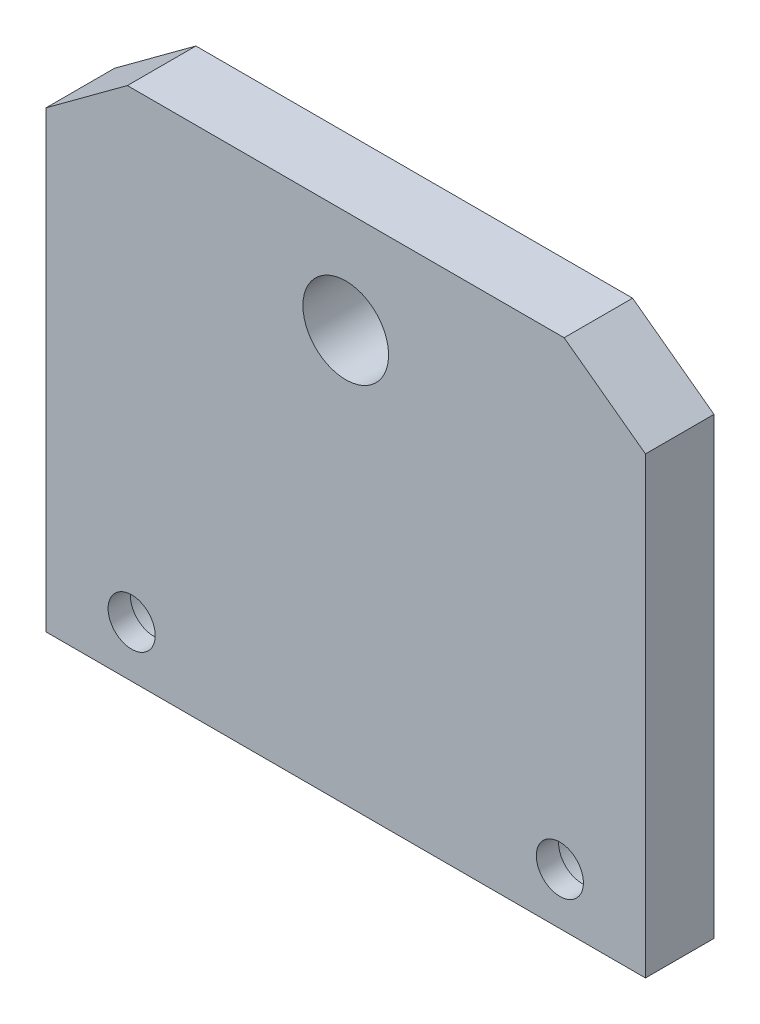
ISO-10303-21;
HEADER;
FILE_DESCRIPTION(('STEP AP214'),'2;1');
FILE_NAME('part.step','',(''),(''),'','','');
FILE_SCHEMA(('AUTOMOTIVE_DESIGN { 1 0 10303 214 1 1 1 1 }'));
ENDSEC;
DATA;
#1=APPLICATION_CONTEXT('core data for automotive mechanical design processes');
#2=APPLICATION_PROTOCOL_DEFINITION('international standard','automotive_design',2000,#1);
#3=PRODUCT_CONTEXT('',#1,'mechanical');
#4=PRODUCT('Part','Part','',(#3));
#5=PRODUCT_RELATED_PRODUCT_CATEGORY('part','',(#4));
#6=PRODUCT_DEFINITION_FORMATION('','',#4);
#7=PRODUCT_DEFINITION_CONTEXT('part definition',#1,'design');
#8=PRODUCT_DEFINITION('design','',#6,#7);
#9=PRODUCT_DEFINITION_SHAPE('','',#8);
#10=(LENGTH_UNIT() NAMED_UNIT(*) SI_UNIT(.MILLI.,.METRE.));
#11=(NAMED_UNIT(*) PLANE_ANGLE_UNIT() SI_UNIT($,.RADIAN.));
#12=(NAMED_UNIT(*) SI_UNIT($,.STERADIAN.) SOLID_ANGLE_UNIT());
#13=UNCERTAINTY_MEASURE_WITH_UNIT(LENGTH_MEASURE(1.E-05),#10,'distance_accuracy_value','');
#14=(GEOMETRIC_REPRESENTATION_CONTEXT(3) GLOBAL_UNCERTAINTY_ASSIGNED_CONTEXT((#13)) GLOBAL_UNIT_ASSIGNED_CONTEXT((#10,
#11,#12)) REPRESENTATION_CONTEXT('',''));
#15=CARTESIAN_POINT('',(0.,0.,0.));
#16=DIRECTION('',(0.,0.,1.));
#17=DIRECTION('',(1.,0.,0.));
#18=AXIS2_PLACEMENT_3D('',#15,#16,#17);
#19=CARTESIAN_POINT('',(-57.7328551190203,45.1684320360903,8.));
#20=DIRECTION('',(0.,1.,0.));
#21=DIRECTION('',(0.,0.,1.));
#22=AXIS2_PLACEMENT_3D('',#19,#20,#21);
#23=PLANE('',#22);
#24=DIRECTION('',(0.,0.,1.));
#25=VECTOR('',#24,1.);
#26=CARTESIAN_POINT('',(-48.2328551190203,45.1684320360903,-34.));
#27=LINE('',#26,#25);
#28=CARTESIAN_POINT('',(-48.2328551190203,45.1684320360903,0.));
#29=VERTEX_POINT('',#28);
#30=CARTESIAN_POINT('',(-48.2328551190203,45.1684320360903,8.));
#31=VERTEX_POINT('',#30);
#32=EDGE_CURVE('E66',#29,#31,#27,.T.);
#33=ORIENTED_EDGE('',*,*,#32,.T.);
#34=DIRECTION('',(1.,0.,0.));
#35=VECTOR('',#34,1.);
#36=CARTESIAN_POINT('',(-57.7328551190203,45.1684320360903,8.));
#37=LINE('',#36,#35);
#38=CARTESIAN_POINT('',(2.76714488097968,45.1684320360903,8.));
#39=VERTEX_POINT('',#38);
#40=EDGE_CURVE('E110',#31,#39,#37,.T.);
#41=ORIENTED_EDGE('',*,*,#40,.T.);
#42=DIRECTION('',(0.,0.,1.));
#43=VECTOR('',#42,1.);
#44=CARTESIAN_POINT('',(2.76714488097968,45.1684320360903,-34.));
#45=LINE('',#44,#43);
#46=CARTESIAN_POINT('',(2.76714488097968,45.1684320360903,0.));
#47=VERTEX_POINT('',#46);
#48=EDGE_CURVE('E147',#47,#39,#45,.T.);
#49=ORIENTED_EDGE('',*,*,#48,.F.);
#50=DIRECTION('',(1.,0.,0.));
#51=VECTOR('',#50,1.);
#52=CARTESIAN_POINT('',(-57.7328551190203,45.1684320360903,0.));
#53=LINE('',#52,#51);
#54=EDGE_CURVE('E126',#29,#47,#53,.T.);
#55=ORIENTED_EDGE('',*,*,#54,.F.);
#56=EDGE_LOOP('',(#33,#41,#49,#55));
#57=FACE_BOUND('',#56,.T.);
#58=ADVANCED_FACE('F43',(#57),#23,.T.);
#59=CARTESIAN_POINT('',(-57.7328551190203,45.1684320360903,8.));
#60=DIRECTION('',(1.,0.,0.));
#61=DIRECTION('',(0.,0.,-1.));
#62=AXIS2_PLACEMENT_3D('',#59,#60,#61);
#63=PLANE('',#62);
#64=DIRECTION('',(0.,-1.,0.));
#65=VECTOR('',#64,1.);
#66=CARTESIAN_POINT('',(-57.7328551190203,45.1684320360903,8.));
#67=LINE('',#66,#65);
#68=CARTESIAN_POINT('',(-57.7328551190203,38.1684320360903,8.));
#69=VERTEX_POINT('',#68);
#70=CARTESIAN_POINT('',(-57.7328551190203,-14.8315679639097,8.));
#71=VERTEX_POINT('',#70);
#72=EDGE_CURVE('E106',#69,#71,#67,.T.);
#73=ORIENTED_EDGE('',*,*,#72,.F.);
#74=DIRECTION('',(0.,0.,1.));
#75=VECTOR('',#74,1.);
#76=CARTESIAN_POINT('',(-57.7328551190203,38.1684320360903,-34.));
#77=LINE('',#76,#75);
#78=CARTESIAN_POINT('',(-57.7328551190203,38.1684320360903,0.));
#79=VERTEX_POINT('',#78);
#80=EDGE_CURVE('E94',#79,#69,#77,.T.);
#81=ORIENTED_EDGE('',*,*,#80,.F.);
#82=DIRECTION('',(0.,-1.,0.));
#83=VECTOR('',#82,1.);
#84=CARTESIAN_POINT('',(-57.7328551190203,45.1684320360903,0.));
#85=LINE('',#84,#83);
#86=CARTESIAN_POINT('',(-57.7328551190203,-14.8315679639097,0.));
#87=VERTEX_POINT('',#86);
#88=EDGE_CURVE('E135',#79,#87,#85,.T.);
#89=ORIENTED_EDGE('',*,*,#88,.T.);
#90=DIRECTION('',(0.,0.,-1.));
#91=VECTOR('',#90,1.);
#92=CARTESIAN_POINT('',(-57.7328551190203,-14.8315679639097,8.));
#93=LINE('',#92,#91);
#94=EDGE_CURVE('E115',#71,#87,#93,.T.);
#95=ORIENTED_EDGE('',*,*,#94,.F.);
#96=EDGE_LOOP('',(#73,#81,#89,#95));
#97=FACE_BOUND('',#96,.T.);
#98=ADVANCED_FACE('F113',(#97),#63,.F.);
#99=CARTESIAN_POINT('',(-57.7328551190203,-14.8315679639097,8.));
#100=DIRECTION('',(0.,1.,0.));
#101=DIRECTION('',(0.,0.,1.));
#102=AXIS2_PLACEMENT_3D('',#99,#100,#101);
#103=PLANE('',#102);
#104=DIRECTION('',(1.,0.,0.));
#105=VECTOR('',#104,1.);
#106=CARTESIAN_POINT('',(-57.7328551190203,-14.8315679639097,0.));
#107=LINE('',#106,#105);
#108=CARTESIAN_POINT('',(12.2671448809797,-14.8315679639097,0.));
#109=VERTEX_POINT('',#108);
#110=EDGE_CURVE('E132',#87,#109,#107,.T.);
#111=ORIENTED_EDGE('',*,*,#110,.T.);
#112=DIRECTION('',(0.,0.,-1.));
#113=VECTOR('',#112,1.);
#114=CARTESIAN_POINT('',(12.2671448809797,-14.8315679639097,8.));
#115=LINE('',#114,#113);
#116=CARTESIAN_POINT('',(12.2671448809797,-14.8315679639097,8.));
#117=VERTEX_POINT('',#116);
#118=EDGE_CURVE('E117',#117,#109,#115,.T.);
#119=ORIENTED_EDGE('',*,*,#118,.F.);
#120=DIRECTION('',(1.,0.,0.));
#121=VECTOR('',#120,1.);
#122=CARTESIAN_POINT('',(-57.7328551190203,-14.8315679639097,8.));
#123=LINE('',#122,#121);
#124=EDGE_CURVE('E118',#71,#117,#123,.T.);
#125=ORIENTED_EDGE('',*,*,#124,.F.);
#126=ORIENTED_EDGE('',*,*,#94,.T.);
#127=EDGE_LOOP('',(#111,#119,#125,#126));
#128=FACE_BOUND('',#127,.T.);
#129=ADVANCED_FACE('F176',(#128),#103,.F.);
#130=CARTESIAN_POINT('',(12.2671448809797,45.1684320360903,8.));
#131=DIRECTION('',(1.,0.,0.));
#132=DIRECTION('',(0.,1.,0.));
#133=AXIS2_PLACEMENT_3D('',#130,#131,#132);
#134=PLANE('',#133);
#135=DIRECTION('',(0.,0.,1.));
#136=VECTOR('',#135,1.);
#137=CARTESIAN_POINT('',(12.2671448809797,38.1684320360903,-34.));
#138=LINE('',#137,#136);
#139=CARTESIAN_POINT('',(12.2671448809797,38.1684320360903,0.));
#140=VERTEX_POINT('',#139);
#141=CARTESIAN_POINT('',(12.2671448809797,38.1684320360903,8.));
#142=VERTEX_POINT('',#141);
#143=EDGE_CURVE('E59',#140,#142,#138,.T.);
#144=ORIENTED_EDGE('',*,*,#143,.T.);
#145=DIRECTION('',(0.,-1.,0.));
#146=VECTOR('',#145,1.);
#147=CARTESIAN_POINT('',(12.2671448809797,45.1684320360903,8.));
#148=LINE('',#147,#146);
#149=EDGE_CURVE('E122',#142,#117,#148,.T.);
#150=ORIENTED_EDGE('',*,*,#149,.T.);
#151=ORIENTED_EDGE('',*,*,#118,.T.);
#152=DIRECTION('',(0.,-1.,0.));
#153=VECTOR('',#152,1.);
#154=CARTESIAN_POINT('',(12.2671448809797,45.1684320360903,0.));
#155=LINE('',#154,#153);
#156=EDGE_CURVE('E129',#140,#109,#155,.T.);
#157=ORIENTED_EDGE('',*,*,#156,.F.);
#158=EDGE_LOOP('',(#144,#150,#151,#157));
#159=FACE_BOUND('',#158,.T.);
#160=ADVANCED_FACE('F172',(#159),#134,.T.);
#161=CARTESIAN_POINT('',(0.,0.,8.));
#162=DIRECTION('',(0.,0.,-1.));
#163=DIRECTION('',(-1.,0.,0.));
#164=AXIS2_PLACEMENT_3D('',#161,#162,#163);
#165=PLANE('',#164);
#166=CARTESIAN_POINT('',(-22.7328551190203,33.1684320360903,7.99999999999999));
#167=DIRECTION('',(0.,0.,-1.));
#168=DIRECTION('',(-1.,0.,0.));
#169=AXIS2_PLACEMENT_3D('',#166,#167,#168);
#170=CIRCLE('',#169,5.);
#171=CARTESIAN_POINT('',(-27.7328551190203,33.1684320360903,7.99999999999999));
#172=VERTEX_POINT('',#171);
#173=EDGE_CURVE('E141',#172,#172,#170,.T.);
#174=ORIENTED_EDGE('',*,*,#173,.T.);
#175=EDGE_LOOP('',(#174));
#176=FACE_BOUND('',#175,.T.);
#177=CARTESIAN_POINT('',(2.26714488097969,-8.83156796390972,8.));
#178=DIRECTION('',(0.,0.,-1.));
#179=DIRECTION('',(-1.,0.,0.));
#180=AXIS2_PLACEMENT_3D('',#177,#178,#179);
#181=CIRCLE('',#180,2.75);
#182=CARTESIAN_POINT('',(-0.48285511902031,-8.83156796390972,8.));
#183=VERTEX_POINT('',#182);
#184=EDGE_CURVE('E165',#183,#183,#181,.T.);
#185=ORIENTED_EDGE('',*,*,#184,.T.);
#186=EDGE_LOOP('',(#185));
#187=FACE_BOUND('',#186,.T.);
#188=CARTESIAN_POINT('',(-47.7328551190203,-8.83156796390972,8.));
#189=DIRECTION('',(0.,0.,-1.));
#190=DIRECTION('',(-1.,0.,0.));
#191=AXIS2_PLACEMENT_3D('',#188,#189,#190);
#192=CIRCLE('',#191,2.75);
#193=CARTESIAN_POINT('',(-50.4828551190203,-8.83156796390972,8.));
#194=VERTEX_POINT('',#193);
#195=EDGE_CURVE('E130',#194,#194,#192,.F.);
#196=ORIENTED_EDGE('',*,*,#195,.F.);
#197=EDGE_LOOP('',(#196));
#198=FACE_BOUND('',#197,.T.);
#199=ORIENTED_EDGE('',*,*,#40,.F.);
#200=DIRECTION('',(0.805055837353368,0.59319903804985,0.));
#201=VECTOR('',#200,1.);
#202=CARTESIAN_POINT('',(-48.2328551190203,45.1684320360903,8.));
#203=LINE('',#202,#201);
#204=EDGE_CURVE('E97',#69,#31,#203,.T.);
#205=ORIENTED_EDGE('',*,*,#204,.F.);
#206=ORIENTED_EDGE('',*,*,#72,.T.);
#207=ORIENTED_EDGE('',*,*,#124,.T.);
#208=ORIENTED_EDGE('',*,*,#149,.F.);
#209=DIRECTION('',(0.805055837353368,-0.59319903804985,0.));
#210=VECTOR('',#209,1.);
#211=CARTESIAN_POINT('',(2.76714488097968,45.1684320360903,8.));
#212=LINE('',#211,#210);
#213=EDGE_CURVE('E111',#39,#142,#212,.T.);
#214=ORIENTED_EDGE('',*,*,#213,.F.);
#215=EDGE_LOOP('',(#199,#205,#206,#207,#208,#214));
#216=FACE_BOUND('',#215,.T.);
#217=ADVANCED_FACE('F104',(#176,#187,#198,#216),#165,.F.);
#218=CARTESIAN_POINT('',(0.,0.,0.));
#219=DIRECTION('',(0.,0.,-1.));
#220=DIRECTION('',(-1.,0.,0.));
#221=AXIS2_PLACEMENT_3D('',#218,#219,#220);
#222=PLANE('',#221);
#223=CARTESIAN_POINT('',(2.26714488097969,-8.83156796390972,0.));
#224=DIRECTION('',(0.,0.,1.));
#225=DIRECTION('',(1.,0.,0.));
#226=AXIS2_PLACEMENT_3D('',#223,#224,#225);
#227=CIRCLE('',#226,5.);
#228=CARTESIAN_POINT('',(-2.73285511902031,-8.83156796390972,0.));
#229=VERTEX_POINT('',#228);
#230=EDGE_CURVE('E157',#229,#229,#227,.T.);
#231=ORIENTED_EDGE('',*,*,#230,.T.);
#232=EDGE_LOOP('',(#231));
#233=FACE_BOUND('',#232,.T.);
#234=CARTESIAN_POINT('',(-47.7328551190203,-8.83156796390972,0.));
#235=DIRECTION('',(0.,0.,1.));
#236=DIRECTION('',(1.,0.,0.));
#237=AXIS2_PLACEMENT_3D('',#234,#235,#236);
#238=CIRCLE('',#237,5.);
#239=CARTESIAN_POINT('',(-52.7328551190203,-8.83156796390972,0.));
#240=VERTEX_POINT('',#239);
#241=EDGE_CURVE('E150',#240,#240,#238,.T.);
#242=ORIENTED_EDGE('',*,*,#241,.T.);
#243=EDGE_LOOP('',(#242));
#244=FACE_BOUND('',#243,.T.);
#245=DIRECTION('',(-0.805055837353368,-0.59319903804985,0.));
#246=VECTOR('',#245,1.);
#247=CARTESIAN_POINT('',(-38.5429847844309,52.3083364931562,0.));
#248=LINE('',#247,#246);
#249=EDGE_CURVE('E11',#29,#79,#248,.T.);
#250=ORIENTED_EDGE('',*,*,#249,.F.);
#251=ORIENTED_EDGE('',*,*,#54,.T.);
#252=DIRECTION('',(-0.805055837353368,0.59319903804985,0.));
#253=VECTOR('',#252,1.);
#254=CARTESIAN_POINT('',(22.5442788478852,30.5958070078441,0.));
#255=LINE('',#254,#253);
#256=EDGE_CURVE('E51',#140,#47,#255,.T.);
#257=ORIENTED_EDGE('',*,*,#256,.F.);
#258=ORIENTED_EDGE('',*,*,#156,.T.);
#259=ORIENTED_EDGE('',*,*,#110,.F.);
#260=ORIENTED_EDGE('',*,*,#88,.F.);
#261=EDGE_LOOP('',(#250,#251,#257,#258,#259,#260));
#262=FACE_BOUND('',#261,.T.);
#263=CARTESIAN_POINT('',(-22.7328551190203,33.1684320360903,0.));
#264=DIRECTION('',(0.,0.,-1.));
#265=DIRECTION('',(-1.,0.,0.));
#266=AXIS2_PLACEMENT_3D('',#263,#264,#265);
#267=CIRCLE('',#266,5.);
#268=CARTESIAN_POINT('',(-27.7328551190203,33.1684320360903,0.));
#269=VERTEX_POINT('',#268);
#270=EDGE_CURVE('E138',#269,#269,#267,.T.);
#271=ORIENTED_EDGE('',*,*,#270,.F.);
#272=EDGE_LOOP('',(#271));
#273=FACE_BOUND('',#272,.T.);
#274=ADVANCED_FACE('F179',(#233,#244,#262,#273),#222,.T.);
#275=CARTESIAN_POINT('',(-47.7328551190203,-8.83156796390972,37.));
#276=DIRECTION('',(0.,0.,-1.));
#277=DIRECTION('',(-1.,0.,0.));
#278=AXIS2_PLACEMENT_3D('',#275,#276,#277);
#279=CYLINDRICAL_SURFACE('',#278,2.75);
#280=CARTESIAN_POINT('',(-47.7328551190203,-8.83156796390972,5.4));
#281=DIRECTION('',(0.,0.,1.));
#282=DIRECTION('',(1.,0.,0.));
#283=AXIS2_PLACEMENT_3D('',#280,#281,#282);
#284=CIRCLE('',#283,2.75);
#285=CARTESIAN_POINT('',(-44.9828551190203,-8.83156796390972,5.4));
#286=VERTEX_POINT('',#285);
#287=EDGE_CURVE('E142',#286,#286,#284,.T.);
#288=ORIENTED_EDGE('',*,*,#287,.F.);
#289=EDGE_LOOP('',(#288));
#290=FACE_BOUND('',#289,.T.);
#291=ORIENTED_EDGE('',*,*,#195,.T.);
#292=EDGE_LOOP('',(#291));
#293=FACE_BOUND('',#292,.T.);
#294=ADVANCED_FACE('F206',(#290,#293),#279,.F.);
#295=CARTESIAN_POINT('',(2.26714488097969,-8.83156796390972,-30.));
#296=DIRECTION('',(0.,0.,1.));
#297=DIRECTION('',(1.,0.,0.));
#298=AXIS2_PLACEMENT_3D('',#295,#296,#297);
#299=CYLINDRICAL_SURFACE('',#298,2.75);
#300=CARTESIAN_POINT('',(2.26714488097969,-8.83156796390972,5.4));
#301=DIRECTION('',(0.,0.,1.));
#302=DIRECTION('',(1.,0.,0.));
#303=AXIS2_PLACEMENT_3D('',#300,#301,#302);
#304=CIRCLE('',#303,2.75);
#305=CARTESIAN_POINT('',(5.01714488097969,-8.83156796390972,5.4));
#306=VERTEX_POINT('',#305);
#307=EDGE_CURVE('E46',#306,#306,#304,.F.);
#308=ORIENTED_EDGE('',*,*,#307,.T.);
#309=EDGE_LOOP('',(#308));
#310=FACE_BOUND('',#309,.T.);
#311=ORIENTED_EDGE('',*,*,#184,.F.);
#312=EDGE_LOOP('',(#311));
#313=FACE_BOUND('',#312,.T.);
#314=ADVANCED_FACE('F212',(#310,#313),#299,.F.);
#315=CARTESIAN_POINT('',(-22.7328551190203,33.1684320360903,-88.));
#316=DIRECTION('',(0.,0.,1.));
#317=DIRECTION('',(1.,0.,0.));
#318=AXIS2_PLACEMENT_3D('',#315,#316,#317);
#319=CYLINDRICAL_SURFACE('',#318,5.);
#320=ORIENTED_EDGE('',*,*,#270,.T.);
#321=EDGE_LOOP('',(#320));
#322=FACE_BOUND('',#321,.T.);
#323=ORIENTED_EDGE('',*,*,#173,.F.);
#324=EDGE_LOOP('',(#323));
#325=FACE_BOUND('',#324,.T.);
#326=ADVANCED_FACE('F216',(#322,#325),#319,.F.);
#327=CARTESIAN_POINT('',(2.76714488097968,45.1684320360903,-34.));
#328=DIRECTION('',(-0.59319903804985,-0.805055837353368,0.));
#329=DIRECTION('',(0.805055837353368,-0.59319903804985,0.));
#330=AXIS2_PLACEMENT_3D('',#327,#328,#329);
#331=PLANE('',#330);
#332=ORIENTED_EDGE('',*,*,#256,.T.);
#333=ORIENTED_EDGE('',*,*,#48,.T.);
#334=ORIENTED_EDGE('',*,*,#213,.T.);
#335=ORIENTED_EDGE('',*,*,#143,.F.);
#336=EDGE_LOOP('',(#332,#333,#334,#335));
#337=FACE_BOUND('',#336,.T.);
#338=ADVANCED_FACE('F183',(#337),#331,.F.);
#339=CARTESIAN_POINT('',(-48.2328551190203,45.1684320360903,-34.));
#340=DIRECTION('',(0.59319903804985,-0.805055837353368,0.));
#341=DIRECTION('',(0.805055837353368,0.59319903804985,0.));
#342=AXIS2_PLACEMENT_3D('',#339,#340,#341);
#343=PLANE('',#342);
#344=ORIENTED_EDGE('',*,*,#249,.T.);
#345=ORIENTED_EDGE('',*,*,#80,.T.);
#346=ORIENTED_EDGE('',*,*,#204,.T.);
#347=ORIENTED_EDGE('',*,*,#32,.F.);
#348=EDGE_LOOP('',(#344,#345,#346,#347));
#349=FACE_BOUND('',#348,.T.);
#350=ADVANCED_FACE('F96',(#349),#343,.F.);
#351=CARTESIAN_POINT('',(-47.7328551190203,-8.83156796390972,5.4));
#352=DIRECTION('',(0.,0.,-1.));
#353=DIRECTION('',(-1.,0.,0.));
#354=AXIS2_PLACEMENT_3D('',#351,#352,#353);
#355=CYLINDRICAL_SURFACE('',#354,5.);
#356=CARTESIAN_POINT('',(-47.7328551190203,-8.83156796390972,5.4));
#357=DIRECTION('',(0.,0.,1.));
#358=DIRECTION('',(1.,0.,0.));
#359=AXIS2_PLACEMENT_3D('',#356,#357,#358);
#360=CIRCLE('',#359,5.);
#361=CARTESIAN_POINT('',(-52.7328551190203,-8.83156796390972,5.4));
#362=VERTEX_POINT('',#361);
#363=EDGE_CURVE('E144',#362,#362,#360,.T.);
#364=CARTESIAN_POINT('',(-52.7328551190203,-8.83156796390972,5.4));
#365=CARTESIAN_POINT('',(-52.7328551190203,-8.83156796390972,5.34375));
#366=CARTESIAN_POINT('',(-52.7328551190203,-8.83156796390972,5.2875));
#367=CARTESIAN_POINT('',(-52.7328551190203,-8.83156796390972,5.175));
#368=CARTESIAN_POINT('',(-52.7328551190203,-8.83156796390972,5.11875));
#369=CARTESIAN_POINT('',(-52.7328551190203,-8.83156796390972,5.00625));
#370=CARTESIAN_POINT('',(-52.7328551190203,-8.83156796390972,4.95));
#371=CARTESIAN_POINT('',(-52.7328551190203,-8.83156796390972,4.8375));
#372=CARTESIAN_POINT('',(-52.7328551190203,-8.83156796390972,4.78125));
#373=CARTESIAN_POINT('',(-52.7328551190203,-8.83156796390972,4.66875));
#374=CARTESIAN_POINT('',(-52.7328551190203,-8.83156796390972,4.6125));
#375=CARTESIAN_POINT('',(-52.7328551190203,-8.83156796390972,4.5));
#376=CARTESIAN_POINT('',(-52.7328551190203,-8.83156796390972,4.44375));
#377=CARTESIAN_POINT('',(-52.7328551190203,-8.83156796390972,4.33125));
#378=CARTESIAN_POINT('',(-52.7328551190203,-8.83156796390972,4.275));
#379=CARTESIAN_POINT('',(-52.7328551190203,-8.83156796390972,4.1625));
#380=CARTESIAN_POINT('',(-52.7328551190203,-8.83156796390972,4.10625));
#381=CARTESIAN_POINT('',(-52.7328551190203,-8.83156796390972,3.99375));
#382=CARTESIAN_POINT('',(-52.7328551190203,-8.83156796390972,3.9375));
#383=CARTESIAN_POINT('',(-52.7328551190203,-8.83156796390972,3.825));
#384=CARTESIAN_POINT('',(-52.7328551190203,-8.83156796390972,3.76875));
#385=CARTESIAN_POINT('',(-52.7328551190203,-8.83156796390972,3.65625));
#386=CARTESIAN_POINT('',(-52.7328551190203,-8.83156796390972,3.6));
#387=CARTESIAN_POINT('',(-52.7328551190203,-8.83156796390972,3.4875));
#388=CARTESIAN_POINT('',(-52.7328551190203,-8.83156796390972,3.43125));
#389=CARTESIAN_POINT('',(-52.7328551190203,-8.83156796390972,3.31875));
#390=CARTESIAN_POINT('',(-52.7328551190203,-8.83156796390972,3.2625));
#391=CARTESIAN_POINT('',(-52.7328551190203,-8.83156796390972,3.15));
#392=CARTESIAN_POINT('',(-52.7328551190203,-8.83156796390972,3.09375));
#393=CARTESIAN_POINT('',(-52.7328551190203,-8.83156796390972,2.98125));
#394=CARTESIAN_POINT('',(-52.7328551190203,-8.83156796390972,2.925));
#395=CARTESIAN_POINT('',(-52.7328551190203,-8.83156796390972,2.8125));
#396=CARTESIAN_POINT('',(-52.7328551190203,-8.83156796390972,2.75625));
#397=CARTESIAN_POINT('',(-52.7328551190203,-8.83156796390972,2.64375));
#398=CARTESIAN_POINT('',(-52.7328551190203,-8.83156796390972,2.5875));
#399=CARTESIAN_POINT('',(-52.7328551190203,-8.83156796390972,2.475));
#400=CARTESIAN_POINT('',(-52.7328551190203,-8.83156796390972,2.41875));
#401=CARTESIAN_POINT('',(-52.7328551190203,-8.83156796390972,2.30625));
#402=CARTESIAN_POINT('',(-52.7328551190203,-8.83156796390972,2.25));
#403=CARTESIAN_POINT('',(-52.7328551190203,-8.83156796390972,2.1375));
#404=CARTESIAN_POINT('',(-52.7328551190203,-8.83156796390972,2.08125));
#405=CARTESIAN_POINT('',(-52.7328551190203,-8.83156796390972,1.96875));
#406=CARTESIAN_POINT('',(-52.7328551190203,-8.83156796390972,1.9125));
#407=CARTESIAN_POINT('',(-52.7328551190203,-8.83156796390972,1.8));
#408=CARTESIAN_POINT('',(-52.7328551190203,-8.83156796390972,1.74375));
#409=CARTESIAN_POINT('',(-52.7328551190203,-8.83156796390972,1.63125));
#410=CARTESIAN_POINT('',(-52.7328551190203,-8.83156796390972,1.575));
#411=CARTESIAN_POINT('',(-52.7328551190203,-8.83156796390972,1.4625));
#412=CARTESIAN_POINT('',(-52.7328551190203,-8.83156796390972,1.40625));
#413=CARTESIAN_POINT('',(-52.7328551190203,-8.83156796390972,1.29375));
#414=CARTESIAN_POINT('',(-52.7328551190203,-8.83156796390972,1.2375));
#415=CARTESIAN_POINT('',(-52.7328551190203,-8.83156796390972,1.125));
#416=CARTESIAN_POINT('',(-52.7328551190203,-8.83156796390972,1.06875));
#417=CARTESIAN_POINT('',(-52.7328551190203,-8.83156796390972,0.956249999999999));
#418=CARTESIAN_POINT('',(-52.7328551190203,-8.83156796390972,0.899999999999999));
#419=CARTESIAN_POINT('',(-52.7328551190203,-8.83156796390972,0.787499999999999));
#420=CARTESIAN_POINT('',(-52.7328551190203,-8.83156796390972,0.731249999999999));
#421=CARTESIAN_POINT('',(-52.7328551190203,-8.83156796390972,0.618749999999999));
#422=CARTESIAN_POINT('',(-52.7328551190203,-8.83156796390972,0.562499999999999));
#423=CARTESIAN_POINT('',(-52.7328551190203,-8.83156796390972,0.449999999999999));
#424=CARTESIAN_POINT('',(-52.7328551190203,-8.83156796390972,0.393749999999999));
#425=CARTESIAN_POINT('',(-52.7328551190203,-8.83156796390972,0.281249999999999));
#426=CARTESIAN_POINT('',(-52.7328551190203,-8.83156796390972,0.224999999999999));
#427=CARTESIAN_POINT('',(-52.7328551190203,-8.83156796390972,0.112499999999999));
#428=CARTESIAN_POINT('',(-52.7328551190203,-8.83156796390972,0.0562499999999989));
#429=CARTESIAN_POINT('',(-52.7328551190203,-8.83156796390972,0.));
#430=B_SPLINE_CURVE_WITH_KNOTS('',3,(#364,#365,#366,#367,#368,#369,#370,#371,#372,#373,#374,
#375,#376,#377,#378,#379,#380,#381,#382,#383,#384,#385,#386,#387,#388,#389,#390,#391,#392,#393,
#394,#395,#396,#397,#398,#399,#400,#401,#402,#403,#404,#405,#406,#407,#408,#409,#410,#411,#412,
#413,#414,#415,#416,#417,#418,#419,#420,#421,#422,#423,#424,#425,#426,#427,#428,#429),
.UNSPECIFIED.,.F.,.F.,(4,2,2,2,2,2,2,2,2,2,2,2,2,2,2,2,2,2,2,2,2,2,2,2,2,2,2,2,2,2,2,2,4),(0.,
0.16875,0.337499999999999,0.50625,0.674999999999999,0.84375,1.0125,1.18125,1.35,1.51875,1.6875,
1.85625,2.025,2.19375,2.3625,2.53125,2.7,2.86875,3.0375,3.20625,3.375,3.54375,3.7125,3.88125,
4.05,4.21875,4.3875,4.55625,4.725,4.89375,5.0625,5.23125,5.4),.UNSPECIFIED.);
#431=EDGE_CURVE('BSEAM223',#362,#240,#430,.T.);
#432=ORIENTED_EDGE('',*,*,#363,.T.);
#433=ORIENTED_EDGE('',*,*,#241,.F.);
#434=ORIENTED_EDGE('',*,*,#431,.T.);
#435=ORIENTED_EDGE('',*,*,#431,.F.);
#436=EDGE_LOOP('',(#432,#434,#433,#435));
#437=FACE_BOUND('',#436,.T.);
#438=ADVANCED_FACE('F223',(#437),#355,.F.);
#439=CARTESIAN_POINT('',(-47.7328551190203,-8.83156796390972,5.4));
#440=DIRECTION('',(0.,0.,1.));
#441=DIRECTION('',(1.,0.,0.));
#442=AXIS2_PLACEMENT_3D('',#439,#440,#441);
#443=PLANE('',#442);
#444=ORIENTED_EDGE('',*,*,#287,.T.);
#445=EDGE_LOOP('',(#444));
#446=FACE_BOUND('',#445,.T.);
#447=ORIENTED_EDGE('',*,*,#363,.F.);
#448=EDGE_LOOP('',(#447));
#449=FACE_BOUND('',#448,.T.);
#450=ADVANCED_FACE('F226',(#446,#449),#443,.F.);
#451=CARTESIAN_POINT('',(2.26714488097969,-8.83156796390972,5.4));
#452=DIRECTION('',(0.,0.,1.));
#453=DIRECTION('',(1.,0.,0.));
#454=AXIS2_PLACEMENT_3D('',#451,#452,#453);
#455=PLANE('',#454);
#456=CARTESIAN_POINT('',(2.26714488097969,-8.83156796390972,5.4));
#457=DIRECTION('',(0.,0.,1.));
#458=DIRECTION('',(1.,0.,0.));
#459=AXIS2_PLACEMENT_3D('',#456,#457,#458);
#460=CIRCLE('',#459,5.);
#461=CARTESIAN_POINT('',(-2.73285511902031,-8.83156796390972,5.4));
#462=VERTEX_POINT('',#461);
#463=EDGE_CURVE('E241',#462,#462,#460,.T.);
#464=ORIENTED_EDGE('',*,*,#463,.F.);
#465=EDGE_LOOP('',(#464));
#466=FACE_BOUND('',#465,.T.);
#467=ORIENTED_EDGE('',*,*,#307,.F.);
#468=EDGE_LOOP('',(#467));
#469=FACE_BOUND('',#468,.T.);
#470=ADVANCED_FACE('F229',(#466,#469),#455,.F.);
#471=CARTESIAN_POINT('',(2.26714488097969,-8.83156796390972,5.4));
#472=DIRECTION('',(0.,0.,-1.));
#473=DIRECTION('',(-1.,0.,0.));
#474=AXIS2_PLACEMENT_3D('',#471,#472,#473);
#475=CYLINDRICAL_SURFACE('',#474,5.);
#476=CARTESIAN_POINT('',(-2.73285511902031,-8.83156796390972,5.4));
#477=CARTESIAN_POINT('',(-2.73285511902031,-8.83156796390972,5.34375));
#478=CARTESIAN_POINT('',(-2.73285511902031,-8.83156796390972,5.2875));
#479=CARTESIAN_POINT('',(-2.73285511902031,-8.83156796390972,5.175));
#480=CARTESIAN_POINT('',(-2.73285511902031,-8.83156796390972,5.11875));
#481=CARTESIAN_POINT('',(-2.73285511902031,-8.83156796390972,5.00625));
#482=CARTESIAN_POINT('',(-2.73285511902031,-8.83156796390972,4.95));
#483=CARTESIAN_POINT('',(-2.73285511902031,-8.83156796390972,4.8375));
#484=CARTESIAN_POINT('',(-2.73285511902031,-8.83156796390972,4.78125));
#485=CARTESIAN_POINT('',(-2.73285511902031,-8.83156796390972,4.66875));
#486=CARTESIAN_POINT('',(-2.73285511902031,-8.83156796390972,4.6125));
#487=CARTESIAN_POINT('',(-2.73285511902031,-8.83156796390972,4.5));
#488=CARTESIAN_POINT('',(-2.73285511902031,-8.83156796390972,4.44375));
#489=CARTESIAN_POINT('',(-2.73285511902031,-8.83156796390972,4.33125));
#490=CARTESIAN_POINT('',(-2.73285511902031,-8.83156796390972,4.275));
#491=CARTESIAN_POINT('',(-2.73285511902031,-8.83156796390972,4.1625));
#492=CARTESIAN_POINT('',(-2.73285511902031,-8.83156796390972,4.10625));
#493=CARTESIAN_POINT('',(-2.73285511902031,-8.83156796390972,3.99375));
#494=CARTESIAN_POINT('',(-2.73285511902031,-8.83156796390972,3.9375));
#495=CARTESIAN_POINT('',(-2.73285511902031,-8.83156796390972,3.825));
#496=CARTESIAN_POINT('',(-2.73285511902031,-8.83156796390972,3.76875));
#497=CARTESIAN_POINT('',(-2.73285511902031,-8.83156796390972,3.65625));
#498=CARTESIAN_POINT('',(-2.73285511902031,-8.83156796390972,3.6));
#499=CARTESIAN_POINT('',(-2.73285511902031,-8.83156796390972,3.4875));
#500=CARTESIAN_POINT('',(-2.73285511902031,-8.83156796390972,3.43125));
#501=CARTESIAN_POINT('',(-2.73285511902031,-8.83156796390972,3.31875));
#502=CARTESIAN_POINT('',(-2.73285511902031,-8.83156796390972,3.2625));
#503=CARTESIAN_POINT('',(-2.73285511902031,-8.83156796390972,3.15));
#504=CARTESIAN_POINT('',(-2.73285511902031,-8.83156796390972,3.09375));
#505=CARTESIAN_POINT('',(-2.73285511902031,-8.83156796390972,2.98125));
#506=CARTESIAN_POINT('',(-2.73285511902031,-8.83156796390972,2.925));
#507=CARTESIAN_POINT('',(-2.73285511902031,-8.83156796390972,2.8125));
#508=CARTESIAN_POINT('',(-2.73285511902031,-8.83156796390972,2.75625));
#509=CARTESIAN_POINT('',(-2.73285511902031,-8.83156796390972,2.64375));
#510=CARTESIAN_POINT('',(-2.73285511902031,-8.83156796390972,2.5875));
#511=CARTESIAN_POINT('',(-2.73285511902031,-8.83156796390972,2.475));
#512=CARTESIAN_POINT('',(-2.73285511902031,-8.83156796390972,2.41875));
#513=CARTESIAN_POINT('',(-2.73285511902031,-8.83156796390972,2.30625));
#514=CARTESIAN_POINT('',(-2.73285511902031,-8.83156796390972,2.25));
#515=CARTESIAN_POINT('',(-2.73285511902031,-8.83156796390972,2.1375));
#516=CARTESIAN_POINT('',(-2.73285511902031,-8.83156796390972,2.08125));
#517=CARTESIAN_POINT('',(-2.73285511902031,-8.83156796390972,1.96875));
#518=CARTESIAN_POINT('',(-2.73285511902031,-8.83156796390972,1.9125));
#519=CARTESIAN_POINT('',(-2.73285511902031,-8.83156796390972,1.8));
#520=CARTESIAN_POINT('',(-2.73285511902031,-8.83156796390972,1.74375));
#521=CARTESIAN_POINT('',(-2.73285511902031,-8.83156796390972,1.63125));
#522=CARTESIAN_POINT('',(-2.73285511902031,-8.83156796390972,1.575));
#523=CARTESIAN_POINT('',(-2.73285511902031,-8.83156796390972,1.4625));
#524=CARTESIAN_POINT('',(-2.73285511902031,-8.83156796390972,1.40625));
#525=CARTESIAN_POINT('',(-2.73285511902031,-8.83156796390972,1.29375));
#526=CARTESIAN_POINT('',(-2.73285511902031,-8.83156796390972,1.2375));
#527=CARTESIAN_POINT('',(-2.73285511902031,-8.83156796390972,1.125));
#528=CARTESIAN_POINT('',(-2.73285511902031,-8.83156796390972,1.06875));
#529=CARTESIAN_POINT('',(-2.73285511902031,-8.83156796390972,0.956249999999999));
#530=CARTESIAN_POINT('',(-2.73285511902031,-8.83156796390972,0.899999999999999));
#531=CARTESIAN_POINT('',(-2.73285511902031,-8.83156796390972,0.787499999999999));
#532=CARTESIAN_POINT('',(-2.73285511902031,-8.83156796390972,0.731249999999999));
#533=CARTESIAN_POINT('',(-2.73285511902031,-8.83156796390972,0.618749999999999));
#534=CARTESIAN_POINT('',(-2.73285511902031,-8.83156796390972,0.562499999999999));
#535=CARTESIAN_POINT('',(-2.73285511902031,-8.83156796390972,0.449999999999999));
#536=CARTESIAN_POINT('',(-2.73285511902031,-8.83156796390972,0.393749999999999));
#537=CARTESIAN_POINT('',(-2.73285511902031,-8.83156796390972,0.281249999999999));
#538=CARTESIAN_POINT('',(-2.73285511902031,-8.83156796390972,0.224999999999999));
#539=CARTESIAN_POINT('',(-2.73285511902031,-8.83156796390972,0.112499999999999));
#540=CARTESIAN_POINT('',(-2.73285511902031,-8.83156796390972,0.0562499999999989));
#541=CARTESIAN_POINT('',(-2.73285511902031,-8.83156796390972,0.));
#542=B_SPLINE_CURVE_WITH_KNOTS('',3,(#476,#477,#478,#479,#480,#481,#482,#483,#484,#485,#486,
#487,#488,#489,#490,#491,#492,#493,#494,#495,#496,#497,#498,#499,#500,#501,#502,#503,#504,#505,
#506,#507,#508,#509,#510,#511,#512,#513,#514,#515,#516,#517,#518,#519,#520,#521,#522,#523,#524,
#525,#526,#527,#528,#529,#530,#531,#532,#533,#534,#535,#536,#537,#538,#539,#540,#541),
.UNSPECIFIED.,.F.,.F.,(4,2,2,2,2,2,2,2,2,2,2,2,2,2,2,2,2,2,2,2,2,2,2,2,2,2,2,2,2,2,2,2,4),(0.,
0.16875,0.337499999999999,0.50625,0.674999999999999,0.84375,1.0125,1.18125,1.35,1.51875,1.6875,
1.85625,2.025,2.19375,2.3625,2.53125,2.7,2.86875,3.0375,3.20625,3.375,3.54375,3.7125,3.88125,
4.05,4.21875,4.3875,4.55625,4.725,4.89375,5.0625,5.23125,5.4),.UNSPECIFIED.);
#543=EDGE_CURVE('BSEAM230',#462,#229,#542,.T.);
#544=ORIENTED_EDGE('',*,*,#463,.T.);
#545=ORIENTED_EDGE('',*,*,#230,.F.);
#546=ORIENTED_EDGE('',*,*,#543,.T.);
#547=ORIENTED_EDGE('',*,*,#543,.F.);
#548=EDGE_LOOP('',(#544,#546,#545,#547));
#549=FACE_BOUND('',#548,.T.);
#550=ADVANCED_FACE('F230',(#549),#475,.F.);
#551=CLOSED_SHELL('',(#58,#98,#129,#160,#217,#274,#294,#314,#326,#338,#350,#438,#450,#470,#550));
#552=MANIFOLD_SOLID_BREP('B2',#551);
#553=ADVANCED_BREP_SHAPE_REPRESENTATION('',(#18,#552),#14);
#554=SHAPE_DEFINITION_REPRESENTATION(#9,#553);
ENDSEC;
END-ISO-10303-21;
